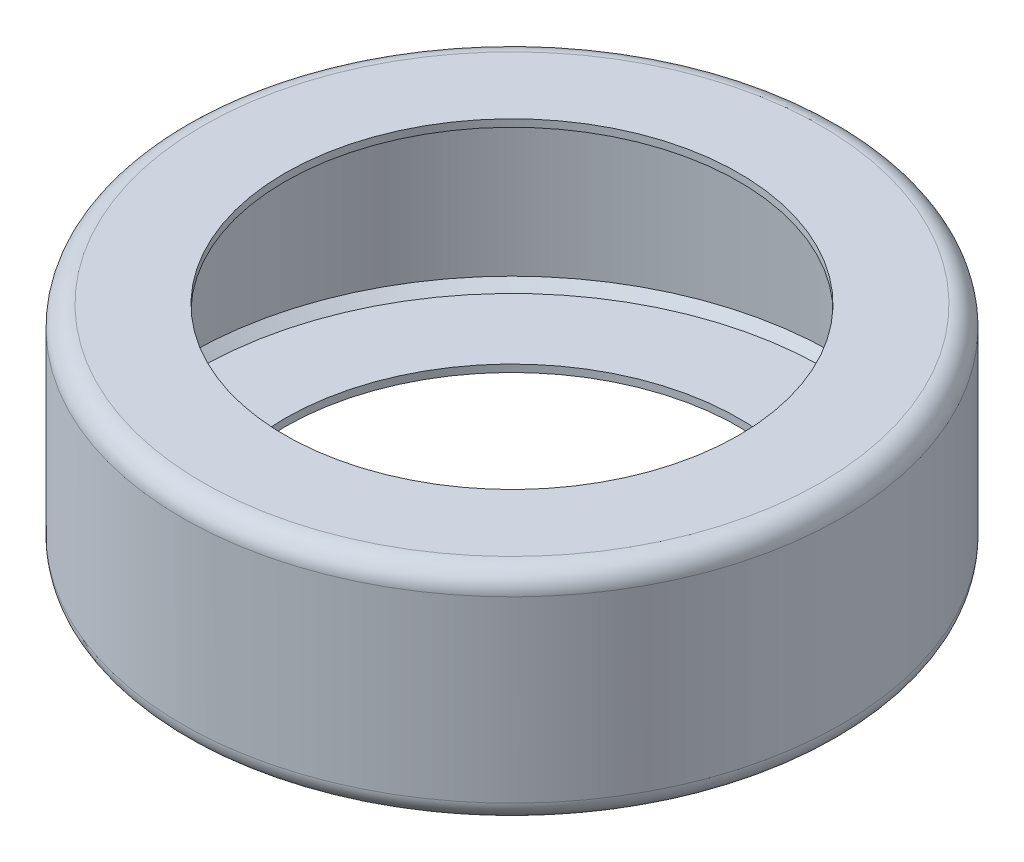
ISO-10303-21;
HEADER;
FILE_DESCRIPTION(('STEP AP214'),'2;1');
FILE_NAME('part.step','',(''),(''),'','','');
FILE_SCHEMA(('AUTOMOTIVE_DESIGN { 1 0 10303 214 1 1 1 1 }'));
ENDSEC;
DATA;
#1=APPLICATION_CONTEXT('core data for automotive mechanical design processes');
#2=APPLICATION_PROTOCOL_DEFINITION('international standard','automotive_design',2000,#1);
#3=PRODUCT_CONTEXT('',#1,'mechanical');
#4=PRODUCT('Part','Part','',(#3));
#5=PRODUCT_RELATED_PRODUCT_CATEGORY('part','',(#4));
#6=PRODUCT_DEFINITION_FORMATION('','',#4);
#7=PRODUCT_DEFINITION_CONTEXT('part definition',#1,'design');
#8=PRODUCT_DEFINITION('design','',#6,#7);
#9=PRODUCT_DEFINITION_SHAPE('','',#8);
#10=(LENGTH_UNIT() NAMED_UNIT(*) SI_UNIT(.MILLI.,.METRE.));
#11=(NAMED_UNIT(*) PLANE_ANGLE_UNIT() SI_UNIT($,.RADIAN.));
#12=(NAMED_UNIT(*) SI_UNIT($,.STERADIAN.) SOLID_ANGLE_UNIT());
#13=UNCERTAINTY_MEASURE_WITH_UNIT(LENGTH_MEASURE(1.E-05),#10,'distance_accuracy_value','');
#14=(GEOMETRIC_REPRESENTATION_CONTEXT(3) GLOBAL_UNCERTAINTY_ASSIGNED_CONTEXT((#13)) GLOBAL_UNIT_ASSIGNED_CONTEXT((#10,
#11,#12)) REPRESENTATION_CONTEXT('',''));
#15=CARTESIAN_POINT('',(0.,0.,0.));
#16=DIRECTION('',(0.,0.,1.));
#17=DIRECTION('',(1.,0.,0.));
#18=AXIS2_PLACEMENT_3D('',#15,#16,#17);
#19=CARTESIAN_POINT('',(11.25,3.75,0.));
#20=DIRECTION('',(0.,-1.,0.));
#21=DIRECTION('',(1.,0.,0.));
#22=AXIS2_PLACEMENT_3D('',#19,#20,#21);
#23=PLANE('',#22);
#24=CARTESIAN_POINT('',(0.,3.75,0.));
#25=DIRECTION('',(0.,-1.,0.));
#26=DIRECTION('',(1.,0.,0.));
#27=AXIS2_PLACEMENT_3D('',#24,#25,#26);
#28=CIRCLE('',#27,10.55);
#29=CARTESIAN_POINT('',(10.55,3.75,0.));
#30=VERTEX_POINT('',#29);
#31=EDGE_CURVE('E53',#30,#30,#28,.F.);
#32=ORIENTED_EDGE('',*,*,#31,.T.);
#33=EDGE_LOOP('',(#32));
#34=FACE_BOUND('',#33,.T.);
#35=CARTESIAN_POINT('',(0.,3.75,0.));
#36=DIRECTION('',(0.,-1.,0.));
#37=DIRECTION('',(1.,0.,0.));
#38=AXIS2_PLACEMENT_3D('',#35,#36,#37);
#39=CIRCLE('',#38,7.75);
#40=CARTESIAN_POINT('',(7.75,3.75,0.));
#41=VERTEX_POINT('',#40);
#42=EDGE_CURVE('E62',#41,#41,#39,.T.);
#43=ORIENTED_EDGE('',*,*,#42,.T.);
#44=EDGE_LOOP('',(#43));
#45=FACE_BOUND('',#44,.T.);
#46=ADVANCED_FACE('F30',(#34,#45),#23,.F.);
#47=CARTESIAN_POINT('',(0.,-3.75,0.));
#48=DIRECTION('',(0.,-1.,0.));
#49=DIRECTION('',(1.,0.,0.));
#50=AXIS2_PLACEMENT_3D('',#47,#48,#49);
#51=CYLINDRICAL_SURFACE('',#50,7.75);
#52=ORIENTED_EDGE('',*,*,#42,.F.);
#53=EDGE_LOOP('',(#52));
#54=FACE_BOUND('',#53,.T.);
#55=CARTESIAN_POINT('',(0.,3.5,0.));
#56=DIRECTION('',(0.,-1.,0.));
#57=DIRECTION('',(1.,0.,0.));
#58=AXIS2_PLACEMENT_3D('',#55,#56,#57);
#59=CIRCLE('',#58,7.75);
#60=CARTESIAN_POINT('',(7.75,3.5,0.));
#61=VERTEX_POINT('',#60);
#62=EDGE_CURVE('E65',#61,#61,#59,.T.);
#63=ORIENTED_EDGE('',*,*,#62,.T.);
#64=EDGE_LOOP('',(#63));
#65=FACE_BOUND('',#64,.T.);
#66=ADVANCED_FACE('F93',(#54,#65),#51,.F.);
#67=CARTESIAN_POINT('',(7.75,3.5,0.));
#68=DIRECTION('',(0.,1.,0.));
#69=DIRECTION('',(-1.,0.,0.));
#70=AXIS2_PLACEMENT_3D('',#67,#68,#69);
#71=PLANE('',#70);
#72=CARTESIAN_POINT('',(0.,3.5,0.));
#73=DIRECTION('',(0.,1.,0.));
#74=DIRECTION('',(-1.,0.,0.));
#75=AXIS2_PLACEMENT_3D('',#72,#73,#74);
#76=CIRCLE('',#75,10.7);
#77=CARTESIAN_POINT('',(-10.7,3.5,0.));
#78=VERTEX_POINT('',#77);
#79=EDGE_CURVE('E45',#78,#78,#76,.F.);
#80=ORIENTED_EDGE('',*,*,#79,.T.);
#81=EDGE_LOOP('',(#80));
#82=FACE_BOUND('',#81,.T.);
#83=ORIENTED_EDGE('',*,*,#62,.F.);
#84=EDGE_LOOP('',(#83));
#85=FACE_BOUND('',#84,.T.);
#86=ADVANCED_FACE('F99',(#82,#85),#71,.F.);
#87=CARTESIAN_POINT('',(0.,-3.75,0.));
#88=DIRECTION('',(0.,-1.,0.));
#89=DIRECTION('',(1.,0.,0.));
#90=AXIS2_PLACEMENT_3D('',#87,#88,#89);
#91=CYLINDRICAL_SURFACE('',#90,11.);
#92=CARTESIAN_POINT('',(0.,3.2,0.));
#93=DIRECTION('',(0.,1.,0.));
#94=DIRECTION('',(-1.,0.,0.));
#95=AXIS2_PLACEMENT_3D('',#92,#93,#94);
#96=CIRCLE('',#95,11.);
#97=CARTESIAN_POINT('',(-11.,3.2,0.));
#98=VERTEX_POINT('',#97);
#99=EDGE_CURVE('E37',#98,#98,#96,.T.);
#100=ORIENTED_EDGE('',*,*,#99,.T.);
#101=EDGE_LOOP('',(#100));
#102=FACE_BOUND('',#101,.T.);
#103=CARTESIAN_POINT('',(0.,-3.19999999999999,0.));
#104=DIRECTION('',(0.,-1.,0.));
#105=DIRECTION('',(1.,0.,0.));
#106=AXIS2_PLACEMENT_3D('',#103,#104,#105);
#107=CIRCLE('',#106,11.);
#108=CARTESIAN_POINT('',(11.,-3.19999999999999,0.));
#109=VERTEX_POINT('',#108);
#110=EDGE_CURVE('E41',#109,#109,#107,.T.);
#111=ORIENTED_EDGE('',*,*,#110,.T.);
#112=EDGE_LOOP('',(#111));
#113=FACE_BOUND('',#112,.T.);
#114=ADVANCED_FACE('F123',(#102,#113),#91,.F.);
#115=CARTESIAN_POINT('',(11.,-3.5,0.));
#116=DIRECTION('',(0.,-1.,0.));
#117=DIRECTION('',(1.,0.,0.));
#118=AXIS2_PLACEMENT_3D('',#115,#116,#117);
#119=PLANE('',#118);
#120=CARTESIAN_POINT('',(0.,-3.5,0.));
#121=DIRECTION('',(0.,-1.,0.));
#122=DIRECTION('',(1.,0.,0.));
#123=AXIS2_PLACEMENT_3D('',#120,#121,#122);
#124=CIRCLE('',#123,10.7);
#125=CARTESIAN_POINT('',(10.7,-3.5,0.));
#126=VERTEX_POINT('',#125);
#127=EDGE_CURVE('E10',#126,#126,#124,.F.);
#128=ORIENTED_EDGE('',*,*,#127,.T.);
#129=EDGE_LOOP('',(#128));
#130=FACE_BOUND('',#129,.T.);
#131=CARTESIAN_POINT('',(0.,-3.5,0.));
#132=DIRECTION('',(0.,-1.,0.));
#133=DIRECTION('',(1.,0.,0.));
#134=AXIS2_PLACEMENT_3D('',#131,#132,#133);
#135=CIRCLE('',#134,7.75);
#136=CARTESIAN_POINT('',(7.75,-3.5,0.));
#137=VERTEX_POINT('',#136);
#138=EDGE_CURVE('E68',#137,#137,#135,.T.);
#139=ORIENTED_EDGE('',*,*,#138,.T.);
#140=EDGE_LOOP('',(#139));
#141=FACE_BOUND('',#140,.T.);
#142=ADVANCED_FACE('F89',(#130,#141),#119,.F.);
#143=CARTESIAN_POINT('',(0.,-3.75,0.));
#144=DIRECTION('',(0.,-1.,0.));
#145=DIRECTION('',(1.,0.,0.));
#146=AXIS2_PLACEMENT_3D('',#143,#144,#145);
#147=CYLINDRICAL_SURFACE('',#146,7.75);
#148=ORIENTED_EDGE('',*,*,#138,.F.);
#149=EDGE_LOOP('',(#148));
#150=FACE_BOUND('',#149,.T.);
#151=CARTESIAN_POINT('',(0.,-3.75,0.));
#152=DIRECTION('',(0.,-1.,0.));
#153=DIRECTION('',(1.,0.,0.));
#154=AXIS2_PLACEMENT_3D('',#151,#152,#153);
#155=CIRCLE('',#154,7.75);
#156=CARTESIAN_POINT('',(7.75,-3.75,0.));
#157=VERTEX_POINT('',#156);
#158=EDGE_CURVE('E71',#157,#157,#155,.T.);
#159=ORIENTED_EDGE('',*,*,#158,.T.);
#160=EDGE_LOOP('',(#159));
#161=FACE_BOUND('',#160,.T.);
#162=ADVANCED_FACE('F75',(#150,#161),#147,.F.);
#163=CARTESIAN_POINT('',(11.25,-3.75,0.));
#164=DIRECTION('',(0.,1.,0.));
#165=DIRECTION('',(-1.,0.,0.));
#166=AXIS2_PLACEMENT_3D('',#163,#164,#165);
#167=PLANE('',#166);
#168=CARTESIAN_POINT('',(0.,-3.75,0.));
#169=DIRECTION('',(0.,1.,0.));
#170=DIRECTION('',(-1.,0.,0.));
#171=AXIS2_PLACEMENT_3D('',#168,#169,#170);
#172=CIRCLE('',#171,10.55);
#173=CARTESIAN_POINT('',(-10.55,-3.75,0.));
#174=VERTEX_POINT('',#173);
#175=EDGE_CURVE('E50',#174,#174,#172,.F.);
#176=ORIENTED_EDGE('',*,*,#175,.T.);
#177=EDGE_LOOP('',(#176));
#178=FACE_BOUND('',#177,.T.);
#179=ORIENTED_EDGE('',*,*,#158,.F.);
#180=EDGE_LOOP('',(#179));
#181=FACE_BOUND('',#180,.T.);
#182=ADVANCED_FACE('F77',(#178,#181),#167,.F.);
#183=CARTESIAN_POINT('',(0.,-3.75,0.));
#184=DIRECTION('',(0.,-1.,0.));
#185=DIRECTION('',(1.,0.,0.));
#186=AXIS2_PLACEMENT_3D('',#183,#184,#185);
#187=CYLINDRICAL_SURFACE('',#186,11.25);
#188=CARTESIAN_POINT('',(0.,3.05,0.));
#189=DIRECTION('',(0.,-1.,0.));
#190=DIRECTION('',(1.,0.,0.));
#191=AXIS2_PLACEMENT_3D('',#188,#189,#190);
#192=CIRCLE('',#191,11.25);
#193=CARTESIAN_POINT('',(11.25,3.05,0.));
#194=VERTEX_POINT('',#193);
#195=EDGE_CURVE('E56',#194,#194,#192,.T.);
#196=ORIENTED_EDGE('',*,*,#195,.T.);
#197=EDGE_LOOP('',(#196));
#198=FACE_BOUND('',#197,.T.);
#199=CARTESIAN_POINT('',(0.,-3.05,0.));
#200=DIRECTION('',(0.,1.,0.));
#201=DIRECTION('',(-1.,0.,0.));
#202=AXIS2_PLACEMENT_3D('',#199,#200,#201);
#203=CIRCLE('',#202,11.25);
#204=CARTESIAN_POINT('',(-11.25,-3.05,0.));
#205=VERTEX_POINT('',#204);
#206=EDGE_CURVE('E59',#205,#205,#203,.T.);
#207=ORIENTED_EDGE('',*,*,#206,.T.);
#208=EDGE_LOOP('',(#207));
#209=FACE_BOUND('',#208,.T.);
#210=ADVANCED_FACE('F79',(#198,#209),#187,.T.);
#211=CARTESIAN_POINT('',(0.,3.05,0.));
#212=DIRECTION('',(0.,-1.,0.));
#213=DIRECTION('',(1.,0.,0.));
#214=AXIS2_PLACEMENT_3D('',#211,#212,#213);
#215=TOROIDAL_SURFACE('',#214,10.55,0.7);
#216=ORIENTED_EDGE('',*,*,#31,.F.);
#217=EDGE_LOOP('',(#216));
#218=FACE_BOUND('',#217,.T.);
#219=ORIENTED_EDGE('',*,*,#195,.F.);
#220=EDGE_LOOP('',(#219));
#221=FACE_BOUND('',#220,.T.);
#222=ADVANCED_FACE('F86',(#218,#221),#215,.T.);
#223=CARTESIAN_POINT('',(0.,-3.05,0.));
#224=DIRECTION('',(0.,1.,0.));
#225=DIRECTION('',(-1.,0.,0.));
#226=AXIS2_PLACEMENT_3D('',#223,#224,#225);
#227=TOROIDAL_SURFACE('',#226,10.55,0.7);
#228=ORIENTED_EDGE('',*,*,#206,.F.);
#229=EDGE_LOOP('',(#228));
#230=FACE_BOUND('',#229,.T.);
#231=ORIENTED_EDGE('',*,*,#175,.F.);
#232=EDGE_LOOP('',(#231));
#233=FACE_BOUND('',#232,.T.);
#234=ADVANCED_FACE('F107',(#230,#233),#227,.T.);
#235=CARTESIAN_POINT('',(0.,3.5,0.));
#236=DIRECTION('',(0.,-1.,0.));
#237=DIRECTION('',(1.,0.,0.));
#238=AXIS2_PLACEMENT_3D('',#235,#236,#237);
#239=CONICAL_SURFACE('',#238,10.7,0.785398163397451);
#240=ORIENTED_EDGE('',*,*,#99,.F.);
#241=EDGE_LOOP('',(#240));
#242=FACE_BOUND('',#241,.T.);
#243=ORIENTED_EDGE('',*,*,#79,.F.);
#244=EDGE_LOOP('',(#243));
#245=FACE_BOUND('',#244,.T.);
#246=ADVANCED_FACE('F110',(#242,#245),#239,.F.);
#247=CARTESIAN_POINT('',(0.,-3.19999999999999,0.));
#248=DIRECTION('',(0.,1.,0.));
#249=DIRECTION('',(-1.,0.,0.));
#250=AXIS2_PLACEMENT_3D('',#247,#248,#249);
#251=CONICAL_SURFACE('',#250,11.,0.785398163397437);
#252=ORIENTED_EDGE('',*,*,#127,.F.);
#253=EDGE_LOOP('',(#252));
#254=FACE_BOUND('',#253,.T.);
#255=ORIENTED_EDGE('',*,*,#110,.F.);
#256=EDGE_LOOP('',(#255));
#257=FACE_BOUND('',#256,.T.);
#258=ADVANCED_FACE('F32',(#254,#257),#251,.F.);
#259=CLOSED_SHELL('',(#46,#66,#86,#114,#142,#162,#182,#210,#222,#234,#246,#258));
#260=MANIFOLD_SOLID_BREP('B2',#259);
#261=ADVANCED_BREP_SHAPE_REPRESENTATION('',(#18,#260),#14);
#262=SHAPE_DEFINITION_REPRESENTATION(#9,#261);
ENDSEC;
END-ISO-10303-21;
